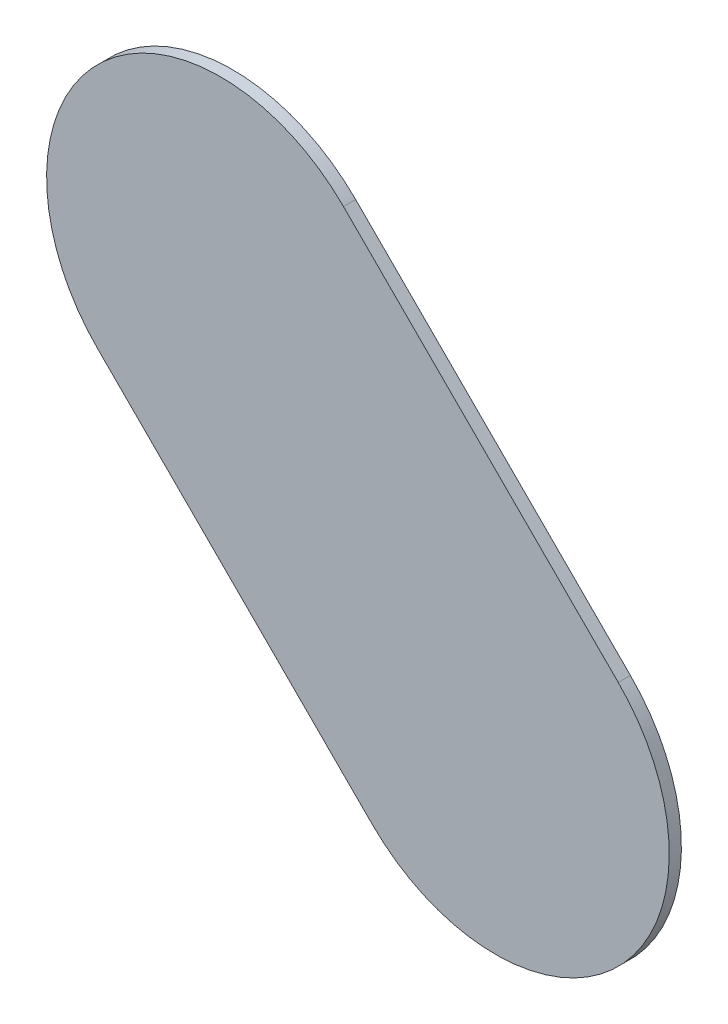
ISO-10303-21;
HEADER;
FILE_DESCRIPTION(('STEP AP214'),'2;1');
FILE_NAME('part.step','',(''),(''),'','','');
FILE_SCHEMA(('AUTOMOTIVE_DESIGN { 1 0 10303 214 1 1 1 1 }'));
ENDSEC;
DATA;
#1=APPLICATION_CONTEXT('core data for automotive mechanical design processes');
#2=APPLICATION_PROTOCOL_DEFINITION('international standard','automotive_design',2000,#1);
#3=PRODUCT_CONTEXT('',#1,'mechanical');
#4=PRODUCT('Part','Part','',(#3));
#5=PRODUCT_RELATED_PRODUCT_CATEGORY('part','',(#4));
#6=PRODUCT_DEFINITION_FORMATION('','',#4);
#7=PRODUCT_DEFINITION_CONTEXT('part definition',#1,'design');
#8=PRODUCT_DEFINITION('design','',#6,#7);
#9=PRODUCT_DEFINITION_SHAPE('','',#8);
#10=(LENGTH_UNIT() NAMED_UNIT(*) SI_UNIT(.MILLI.,.METRE.));
#11=(NAMED_UNIT(*) PLANE_ANGLE_UNIT() SI_UNIT($,.RADIAN.));
#12=(NAMED_UNIT(*) SI_UNIT($,.STERADIAN.) SOLID_ANGLE_UNIT());
#13=UNCERTAINTY_MEASURE_WITH_UNIT(LENGTH_MEASURE(1.E-05),#10,'distance_accuracy_value','');
#14=(GEOMETRIC_REPRESENTATION_CONTEXT(3) GLOBAL_UNCERTAINTY_ASSIGNED_CONTEXT((#13)) GLOBAL_UNIT_ASSIGNED_CONTEXT((#10,
#11,#12)) REPRESENTATION_CONTEXT('',''));
#15=CARTESIAN_POINT('',(0.,0.,0.));
#16=DIRECTION('',(0.,0.,1.));
#17=DIRECTION('',(1.,0.,0.));
#18=AXIS2_PLACEMENT_3D('',#15,#16,#17);
#19=CARTESIAN_POINT('',(155.473553,-95.196446,1.635));
#20=DIRECTION('',(0.,0.,1.));
#21=DIRECTION('',(1.,0.,0.));
#22=AXIS2_PLACEMENT_3D('',#19,#20,#21);
#23=PLANE('',#22);
#24=DIRECTION('',(-0.707106781186548,0.707106781186548,0.));
#25=VECTOR('',#24,1.);
#26=CARTESIAN_POINT('',(155.473553,-95.196446,1.635));
#27=LINE('',#26,#25);
#28=CARTESIAN_POINT('',(155.473553,-95.196446,1.635));
#29=VERTEX_POINT('',#28);
#30=CARTESIAN_POINT('',(154.683553,-94.406446,1.635));
#31=VERTEX_POINT('',#30);
#32=EDGE_CURVE('E82',#29,#31,#27,.T.);
#33=ORIENTED_EDGE('',*,*,#32,.T.);
#34=CARTESIAN_POINT('',(154.3299995,-94.7599995,1.635));
#35=DIRECTION('',(0.,0.,1.));
#36=DIRECTION('',(0.707106781186548,0.707106781186548,0.));
#37=AXIS2_PLACEMENT_3D('',#34,#35,#36);
#38=CIRCLE('',#37,0.500000154724);
#39=CARTESIAN_POINT('',(153.976446,-95.113553,1.635));
#40=VERTEX_POINT('',#39);
#41=EDGE_CURVE('E98',#31,#40,#38,.T.);
#42=ORIENTED_EDGE('',*,*,#41,.T.);
#43=DIRECTION('',(0.707106781186548,-0.707106781186548,0.));
#44=VECTOR('',#43,1.);
#45=CARTESIAN_POINT('',(153.976446,-95.113553,1.635));
#46=LINE('',#45,#44);
#47=CARTESIAN_POINT('',(154.766446,-95.903553,1.635));
#48=VERTEX_POINT('',#47);
#49=EDGE_CURVE('E74',#40,#48,#46,.T.);
#50=ORIENTED_EDGE('',*,*,#49,.T.);
#51=CARTESIAN_POINT('',(155.1199995,-95.5499995,1.635));
#52=DIRECTION('',(0.,0.,1.));
#53=DIRECTION('',(-0.707106781186548,-0.707106781186548,0.));
#54=AXIS2_PLACEMENT_3D('',#51,#52,#53);
#55=CIRCLE('',#54,0.500000154724);
#56=EDGE_CURVE('E11',#48,#29,#55,.T.);
#57=ORIENTED_EDGE('',*,*,#56,.T.);
#58=EDGE_LOOP('',(#33,#42,#50,#57));
#59=FACE_BOUND('',#58,.T.);
#60=ADVANCED_FACE('F17',(#59),#23,.T.);
#61=CARTESIAN_POINT('',(155.473553,-95.196446,1.6));
#62=DIRECTION('',(0.,0.,1.));
#63=DIRECTION('',(1.,0.,0.));
#64=AXIS2_PLACEMENT_3D('',#61,#62,#63);
#65=PLANE('',#64);
#66=CARTESIAN_POINT('',(155.1199995,-95.5499995,1.6));
#67=DIRECTION('',(0.,0.,1.));
#68=DIRECTION('',(-0.707106781186548,-0.707106781186548,0.));
#69=AXIS2_PLACEMENT_3D('',#66,#67,#68);
#70=CIRCLE('',#69,0.500000154724);
#71=CARTESIAN_POINT('',(154.766446,-95.903553,1.6));
#72=VERTEX_POINT('',#71);
#73=CARTESIAN_POINT('',(155.473553,-95.196446,1.6));
#74=VERTEX_POINT('',#73);
#75=EDGE_CURVE('E25',#72,#74,#70,.T.);
#76=ORIENTED_EDGE('',*,*,#75,.F.);
#77=DIRECTION('',(0.707106781186548,-0.707106781186548,0.));
#78=VECTOR('',#77,1.);
#79=CARTESIAN_POINT('',(153.976446,-95.113553,1.6));
#80=LINE('',#79,#78);
#81=CARTESIAN_POINT('',(153.976446,-95.113553,1.6));
#82=VERTEX_POINT('',#81);
#83=EDGE_CURVE('E110',#82,#72,#80,.T.);
#84=ORIENTED_EDGE('',*,*,#83,.F.);
#85=CARTESIAN_POINT('',(154.3299995,-94.7599995,1.6));
#86=DIRECTION('',(0.,0.,1.));
#87=DIRECTION('',(0.707106781186548,0.707106781186548,0.));
#88=AXIS2_PLACEMENT_3D('',#85,#86,#87);
#89=CIRCLE('',#88,0.500000154724);
#90=CARTESIAN_POINT('',(154.683553,-94.406446,1.6));
#91=VERTEX_POINT('',#90);
#92=EDGE_CURVE('E84',#91,#82,#89,.T.);
#93=ORIENTED_EDGE('',*,*,#92,.F.);
#94=DIRECTION('',(-0.707106781186548,0.707106781186548,0.));
#95=VECTOR('',#94,1.);
#96=CARTESIAN_POINT('',(155.473553,-95.196446,1.6));
#97=LINE('',#96,#95);
#98=EDGE_CURVE('E80',#74,#91,#97,.T.);
#99=ORIENTED_EDGE('',*,*,#98,.F.);
#100=EDGE_LOOP('',(#76,#84,#93,#99));
#101=FACE_BOUND('',#100,.T.);
#102=ADVANCED_FACE('F86',(#101),#65,.F.);
#103=CARTESIAN_POINT('',(155.1199995,-95.5499995,1.6));
#104=DIRECTION('',(0.,0.,-1.));
#105=DIRECTION('',(-0.707106781186548,-0.707106781186548,0.));
#106=AXIS2_PLACEMENT_3D('',#103,#104,#105);
#107=CYLINDRICAL_SURFACE('',#106,0.500000154724);
#108=ORIENTED_EDGE('',*,*,#75,.T.);
#109=DIRECTION('',(0.,0.,1.));
#110=VECTOR('',#109,1.);
#111=CARTESIAN_POINT('',(155.473553,-95.196446,1.6));
#112=LINE('',#111,#110);
#113=EDGE_CURVE('E68',#74,#29,#112,.T.);
#114=ORIENTED_EDGE('',*,*,#113,.T.);
#115=ORIENTED_EDGE('',*,*,#56,.F.);
#116=DIRECTION('',(0.,0.,1.));
#117=VECTOR('',#116,1.);
#118=CARTESIAN_POINT('',(154.766446,-95.903553,1.6));
#119=LINE('',#118,#117);
#120=EDGE_CURVE('E71',#72,#48,#119,.T.);
#121=ORIENTED_EDGE('',*,*,#120,.F.);
#122=EDGE_LOOP('',(#108,#114,#115,#121));
#123=FACE_BOUND('',#122,.T.);
#124=ADVANCED_FACE('F67',(#123),#107,.T.);
#125=CARTESIAN_POINT('',(153.976446,-95.113553,1.6));
#126=DIRECTION('',(0.707106781186548,0.707106781186548,0.));
#127=DIRECTION('',(0.,0.,-1.));
#128=AXIS2_PLACEMENT_3D('',#125,#126,#127);
#129=PLANE('',#128);
#130=ORIENTED_EDGE('',*,*,#83,.T.);
#131=ORIENTED_EDGE('',*,*,#120,.T.);
#132=ORIENTED_EDGE('',*,*,#49,.F.);
#133=DIRECTION('',(0.,0.,1.));
#134=VECTOR('',#133,1.);
#135=CARTESIAN_POINT('',(153.976446,-95.113553,1.6));
#136=LINE('',#135,#134);
#137=EDGE_CURVE('E101',#82,#40,#136,.T.);
#138=ORIENTED_EDGE('',*,*,#137,.F.);
#139=EDGE_LOOP('',(#130,#131,#132,#138));
#140=FACE_BOUND('',#139,.T.);
#141=ADVANCED_FACE('F124',(#140),#129,.F.);
#142=CARTESIAN_POINT('',(154.3299995,-94.7599995,1.6));
#143=DIRECTION('',(0.,0.,-1.));
#144=DIRECTION('',(0.707106781186548,0.707106781186548,0.));
#145=AXIS2_PLACEMENT_3D('',#142,#143,#144);
#146=CYLINDRICAL_SURFACE('',#145,0.500000154724);
#147=ORIENTED_EDGE('',*,*,#92,.T.);
#148=ORIENTED_EDGE('',*,*,#137,.T.);
#149=ORIENTED_EDGE('',*,*,#41,.F.);
#150=DIRECTION('',(0.,0.,1.));
#151=VECTOR('',#150,1.);
#152=CARTESIAN_POINT('',(154.683553,-94.406446,1.6));
#153=LINE('',#152,#151);
#154=EDGE_CURVE('E90',#91,#31,#153,.T.);
#155=ORIENTED_EDGE('',*,*,#154,.F.);
#156=EDGE_LOOP('',(#147,#148,#149,#155));
#157=FACE_BOUND('',#156,.T.);
#158=ADVANCED_FACE('F123',(#157),#146,.T.);
#159=CARTESIAN_POINT('',(155.473553,-95.196446,1.6));
#160=DIRECTION('',(-0.707106781186548,-0.707106781186548,0.));
#161=DIRECTION('',(-0.707106781186548,0.707106781186548,0.));
#162=AXIS2_PLACEMENT_3D('',#159,#160,#161);
#163=PLANE('',#162);
#164=ORIENTED_EDGE('',*,*,#98,.T.);
#165=ORIENTED_EDGE('',*,*,#154,.T.);
#166=ORIENTED_EDGE('',*,*,#32,.F.);
#167=ORIENTED_EDGE('',*,*,#113,.F.);
#168=EDGE_LOOP('',(#164,#165,#166,#167));
#169=FACE_BOUND('',#168,.T.);
#170=ADVANCED_FACE('F78',(#169),#163,.F.);
#171=CLOSED_SHELL('',(#60,#102,#124,#141,#158,#170));
#172=MANIFOLD_SOLID_BREP('B1',#171);
#173=ADVANCED_BREP_SHAPE_REPRESENTATION('',(#18,#172),#14);
#174=SHAPE_DEFINITION_REPRESENTATION(#9,#173);
ENDSEC;
END-ISO-10303-21;
